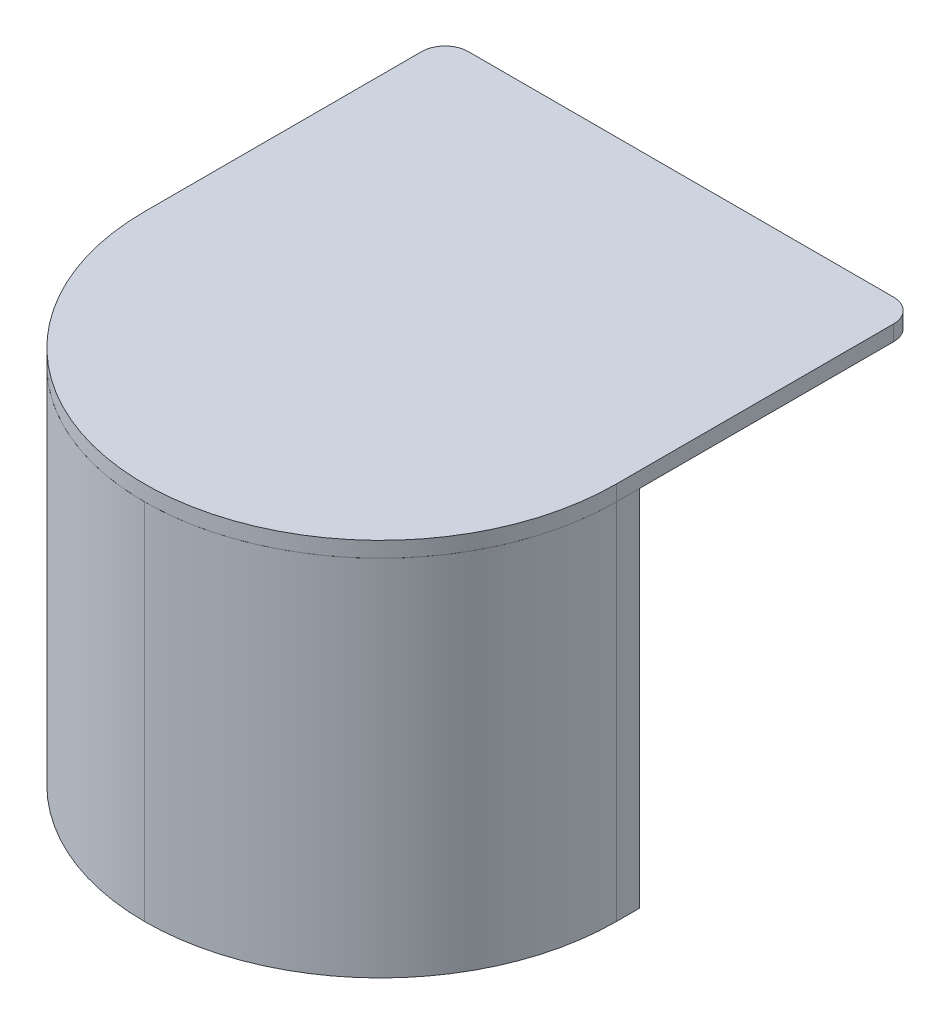
ISO-10303-21;
HEADER;
FILE_DESCRIPTION(('STEP AP214'),'2;1');
FILE_NAME('part.step','',(''),(''),'','','');
FILE_SCHEMA(('AUTOMOTIVE_DESIGN { 1 0 10303 214 1 1 1 1 }'));
ENDSEC;
DATA;
#1=APPLICATION_CONTEXT('core data for automotive mechanical design processes');
#2=APPLICATION_PROTOCOL_DEFINITION('international standard','automotive_design',2000,#1);
#3=PRODUCT_CONTEXT('',#1,'mechanical');
#4=PRODUCT('Part','Part','',(#3));
#5=PRODUCT_RELATED_PRODUCT_CATEGORY('part','',(#4));
#6=PRODUCT_DEFINITION_FORMATION('','',#4);
#7=PRODUCT_DEFINITION_CONTEXT('part definition',#1,'design');
#8=PRODUCT_DEFINITION('design','',#6,#7);
#9=PRODUCT_DEFINITION_SHAPE('','',#8);
#10=(LENGTH_UNIT() NAMED_UNIT(*) SI_UNIT(.MILLI.,.METRE.));
#11=(NAMED_UNIT(*) PLANE_ANGLE_UNIT() SI_UNIT($,.RADIAN.));
#12=(NAMED_UNIT(*) SI_UNIT($,.STERADIAN.) SOLID_ANGLE_UNIT());
#13=UNCERTAINTY_MEASURE_WITH_UNIT(LENGTH_MEASURE(1.E-05),#10,'distance_accuracy_value','');
#14=(GEOMETRIC_REPRESENTATION_CONTEXT(3) GLOBAL_UNCERTAINTY_ASSIGNED_CONTEXT((#13)) GLOBAL_UNIT_ASSIGNED_CONTEXT((#10,
#11,#12)) REPRESENTATION_CONTEXT('',''));
#15=CARTESIAN_POINT('',(0.,0.,0.));
#16=DIRECTION('',(0.,0.,1.));
#17=DIRECTION('',(1.,0.,0.));
#18=AXIS2_PLACEMENT_3D('',#15,#16,#17);
#19=CARTESIAN_POINT('',(0.,49.,-52.5965975451931));
#20=DIRECTION('',(0.,0.,-1.));
#21=DIRECTION('',(-1.,0.,0.));
#22=AXIS2_PLACEMENT_3D('',#19,#20,#21);
#23=PLANE('',#22);
#24=DIRECTION('',(1.,0.,0.));
#25=VECTOR('',#24,1.);
#26=CARTESIAN_POINT('',(0.,47.,-52.5965975451931));
#27=LINE('',#26,#25);
#28=CARTESIAN_POINT('',(-27.5,47.,-52.5965975451931));
#29=VERTEX_POINT('',#28);
#30=CARTESIAN_POINT('',(27.5,47.,-52.5965975451931));
#31=VERTEX_POINT('',#30);
#32=EDGE_CURVE('E130',#29,#31,#27,.T.);
#33=ORIENTED_EDGE('',*,*,#32,.F.);
#34=DIRECTION('',(0.,-1.,0.));
#35=VECTOR('',#34,1.);
#36=CARTESIAN_POINT('',(-27.5,49.,-52.5965975451931));
#37=LINE('',#36,#35);
#38=CARTESIAN_POINT('',(-27.5,49.,-52.5965975451931));
#39=VERTEX_POINT('',#38);
#40=EDGE_CURVE('E147',#29,#39,#37,.F.);
#41=ORIENTED_EDGE('',*,*,#40,.T.);
#42=DIRECTION('',(1.,0.,0.));
#43=VECTOR('',#42,1.);
#44=CARTESIAN_POINT('',(0.,49.,-52.5965975451931));
#45=LINE('',#44,#43);
#46=CARTESIAN_POINT('',(27.5,49.,-52.5965975451931));
#47=VERTEX_POINT('',#46);
#48=EDGE_CURVE('E111',#39,#47,#45,.T.);
#49=ORIENTED_EDGE('',*,*,#48,.T.);
#50=DIRECTION('',(0.,-1.,0.));
#51=VECTOR('',#50,1.);
#52=CARTESIAN_POINT('',(27.5,47.,-52.5965975451931));
#53=LINE('',#52,#51);
#54=EDGE_CURVE('E144',#47,#31,#53,.T.);
#55=ORIENTED_EDGE('',*,*,#54,.T.);
#56=EDGE_LOOP('',(#33,#41,#49,#55));
#57=FACE_BOUND('',#56,.T.);
#58=ADVANCED_FACE('F49',(#57),#23,.T.);
#59=CARTESIAN_POINT('',(-30.5,49.,0.));
#60=DIRECTION('',(1.,0.,0.));
#61=DIRECTION('',(0.,0.,-1.));
#62=AXIS2_PLACEMENT_3D('',#59,#60,#61);
#63=PLANE('',#62);
#64=DIRECTION('',(0.,0.,1.));
#65=VECTOR('',#64,1.);
#66=CARTESIAN_POINT('',(-30.5,49.,0.));
#67=LINE('',#66,#65);
#68=CARTESIAN_POINT('',(-30.5,49.,-49.5965975451931));
#69=VERTEX_POINT('',#68);
#70=CARTESIAN_POINT('',(-30.5,49.,-13.75));
#71=VERTEX_POINT('',#70);
#72=EDGE_CURVE('E101',#69,#71,#67,.T.);
#73=ORIENTED_EDGE('',*,*,#72,.F.);
#74=DIRECTION('',(0.,-1.,0.));
#75=VECTOR('',#74,1.);
#76=CARTESIAN_POINT('',(-30.5,47.,-49.5965975451931));
#77=LINE('',#76,#75);
#78=CARTESIAN_POINT('',(-30.5,47.,-49.5965975451931));
#79=VERTEX_POINT('',#78);
#80=EDGE_CURVE('E120',#69,#79,#77,.T.);
#81=ORIENTED_EDGE('',*,*,#80,.T.);
#82=DIRECTION('',(0.,0.,1.));
#83=VECTOR('',#82,1.);
#84=CARTESIAN_POINT('',(-30.5,47.,0.));
#85=LINE('',#84,#83);
#86=CARTESIAN_POINT('',(-30.5,47.,-13.75));
#87=VERTEX_POINT('',#86);
#88=EDGE_CURVE('E117',#79,#87,#85,.T.);
#89=ORIENTED_EDGE('',*,*,#88,.T.);
#90=DIRECTION('',(0.,-1.,0.));
#91=VECTOR('',#90,1.);
#92=CARTESIAN_POINT('',(-30.5,49.,-13.75));
#93=LINE('',#92,#91);
#94=EDGE_CURVE('E114',#71,#87,#93,.T.);
#95=ORIENTED_EDGE('',*,*,#94,.F.);
#96=EDGE_LOOP('',(#73,#81,#89,#95));
#97=FACE_BOUND('',#96,.T.);
#98=ADVANCED_FACE('F115',(#97),#63,.F.);
#99=CARTESIAN_POINT('',(0.,49.,-13.75));
#100=DIRECTION('',(0.,-1.,0.));
#101=DIRECTION('',(0.,0.,-1.));
#102=AXIS2_PLACEMENT_3D('',#99,#100,#101);
#103=CYLINDRICAL_SURFACE('',#102,30.5);
#104=CARTESIAN_POINT('',(0.,47.,-13.75));
#105=DIRECTION('',(0.,1.,0.));
#106=DIRECTION('',(0.,0.,1.));
#107=AXIS2_PLACEMENT_3D('',#104,#105,#106);
#108=CIRCLE('',#107,30.5);
#109=CARTESIAN_POINT('',(30.5,47.,-13.75));
#110=VERTEX_POINT('',#109);
#111=EDGE_CURVE('E134',#87,#110,#108,.T.);
#112=ORIENTED_EDGE('',*,*,#111,.T.);
#113=DIRECTION('',(0.,-1.,0.));
#114=VECTOR('',#113,1.);
#115=CARTESIAN_POINT('',(30.5,49.,-13.75));
#116=LINE('',#115,#114);
#117=CARTESIAN_POINT('',(30.5,49.,-13.75));
#118=VERTEX_POINT('',#117);
#119=EDGE_CURVE('E121',#118,#110,#116,.T.);
#120=ORIENTED_EDGE('',*,*,#119,.F.);
#121=CARTESIAN_POINT('',(0.,49.,-13.75));
#122=DIRECTION('',(0.,1.,0.));
#123=DIRECTION('',(0.,0.,1.));
#124=AXIS2_PLACEMENT_3D('',#121,#122,#123);
#125=CIRCLE('',#124,30.5);
#126=EDGE_CURVE('E105',#71,#118,#125,.T.);
#127=ORIENTED_EDGE('',*,*,#126,.F.);
#128=ORIENTED_EDGE('',*,*,#94,.T.);
#129=EDGE_LOOP('',(#112,#120,#127,#128));
#130=FACE_BOUND('',#129,.T.);
#131=ADVANCED_FACE('F123',(#130),#103,.T.);
#132=CARTESIAN_POINT('',(30.5,49.,0.));
#133=DIRECTION('',(-1.,0.,0.));
#134=DIRECTION('',(0.,0.,1.));
#135=AXIS2_PLACEMENT_3D('',#132,#133,#134);
#136=PLANE('',#135);
#137=DIRECTION('',(0.,0.,-1.));
#138=VECTOR('',#137,1.);
#139=CARTESIAN_POINT('',(30.5,47.,0.));
#140=LINE('',#139,#138);
#141=CARTESIAN_POINT('',(30.5,47.,-49.5965975451931));
#142=VERTEX_POINT('',#141);
#143=EDGE_CURVE('E136',#110,#142,#140,.T.);
#144=ORIENTED_EDGE('',*,*,#143,.T.);
#145=DIRECTION('',(0.,-1.,0.));
#146=VECTOR('',#145,1.);
#147=CARTESIAN_POINT('',(30.5,49.,-49.5965975451931));
#148=LINE('',#147,#146);
#149=CARTESIAN_POINT('',(30.5,49.,-49.5965975451931));
#150=VERTEX_POINT('',#149);
#151=EDGE_CURVE('E12',#142,#150,#148,.F.);
#152=ORIENTED_EDGE('',*,*,#151,.T.);
#153=DIRECTION('',(0.,0.,-1.));
#154=VECTOR('',#153,1.);
#155=CARTESIAN_POINT('',(30.5,49.,0.));
#156=LINE('',#155,#154);
#157=EDGE_CURVE('E125',#118,#150,#156,.T.);
#158=ORIENTED_EDGE('',*,*,#157,.F.);
#159=ORIENTED_EDGE('',*,*,#119,.T.);
#160=EDGE_LOOP('',(#144,#152,#158,#159));
#161=FACE_BOUND('',#160,.T.);
#162=ADVANCED_FACE('F158',(#161),#136,.F.);
#163=CARTESIAN_POINT('',(0.,49.,0.));
#164=DIRECTION('',(0.,1.,0.));
#165=DIRECTION('',(0.,0.,1.));
#166=AXIS2_PLACEMENT_3D('',#163,#164,#165);
#167=PLANE('',#166);
#168=ORIENTED_EDGE('',*,*,#48,.F.);
#169=CARTESIAN_POINT('',(-27.5,49.,-49.5965975451931));
#170=DIRECTION('',(0.,1.,0.));
#171=DIRECTION('',(0.,0.,1.));
#172=AXIS2_PLACEMENT_3D('',#169,#170,#171);
#173=CIRCLE('',#172,3.);
#174=EDGE_CURVE('E57',#39,#69,#173,.T.);
#175=ORIENTED_EDGE('',*,*,#174,.T.);
#176=ORIENTED_EDGE('',*,*,#72,.T.);
#177=ORIENTED_EDGE('',*,*,#126,.T.);
#178=ORIENTED_EDGE('',*,*,#157,.T.);
#179=CARTESIAN_POINT('',(27.5,49.,-49.5965975451931));
#180=DIRECTION('',(0.,1.,0.));
#181=DIRECTION('',(0.,0.,1.));
#182=AXIS2_PLACEMENT_3D('',#179,#180,#181);
#183=CIRCLE('',#182,3.);
#184=EDGE_CURVE('E69',#150,#47,#183,.T.);
#185=ORIENTED_EDGE('',*,*,#184,.T.);
#186=EDGE_LOOP('',(#168,#175,#176,#177,#178,#185));
#187=FACE_BOUND('',#186,.T.);
#188=ADVANCED_FACE('F103',(#187),#167,.T.);
#189=CARTESIAN_POINT('',(0.,47.,0.));
#190=DIRECTION('',(0.,1.,0.));
#191=DIRECTION('',(0.,0.,1.));
#192=AXIS2_PLACEMENT_3D('',#189,#190,#191);
#193=PLANE('',#192);
#194=ORIENTED_EDGE('',*,*,#88,.F.);
#195=CARTESIAN_POINT('',(-27.5,47.,-49.5965975451931));
#196=DIRECTION('',(0.,1.,0.));
#197=DIRECTION('',(0.,0.,1.));
#198=AXIS2_PLACEMENT_3D('',#195,#196,#197);
#199=CIRCLE('',#198,3.);
#200=EDGE_CURVE('E142',#79,#29,#199,.F.);
#201=ORIENTED_EDGE('',*,*,#200,.T.);
#202=ORIENTED_EDGE('',*,*,#32,.T.);
#203=CARTESIAN_POINT('',(27.5,47.,-49.5965975451931));
#204=DIRECTION('',(0.,1.,0.));
#205=DIRECTION('',(0.,0.,1.));
#206=AXIS2_PLACEMENT_3D('',#203,#204,#205);
#207=CIRCLE('',#206,3.);
#208=EDGE_CURVE('E140',#31,#142,#207,.F.);
#209=ORIENTED_EDGE('',*,*,#208,.T.);
#210=ORIENTED_EDGE('',*,*,#143,.F.);
#211=ORIENTED_EDGE('',*,*,#111,.F.);
#212=EDGE_LOOP('',(#194,#201,#202,#209,#210,#211));
#213=FACE_BOUND('',#212,.T.);
#214=ADVANCED_FACE('F156',(#213),#193,.F.);
#215=CARTESIAN_POINT('',(-27.5,49.,-49.5965975451931));
#216=DIRECTION('',(0.,1.,0.));
#217=DIRECTION('',(0.,0.,1.));
#218=AXIS2_PLACEMENT_3D('',#215,#216,#217);
#219=CYLINDRICAL_SURFACE('',#218,3.);
#220=ORIENTED_EDGE('',*,*,#174,.F.);
#221=ORIENTED_EDGE('',*,*,#40,.F.);
#222=ORIENTED_EDGE('',*,*,#200,.F.);
#223=ORIENTED_EDGE('',*,*,#80,.F.);
#224=EDGE_LOOP('',(#220,#221,#222,#223));
#225=FACE_BOUND('',#224,.T.);
#226=ADVANCED_FACE('F154',(#225),#219,.T.);
#227=CARTESIAN_POINT('',(27.5,49.,-49.5965975451931));
#228=DIRECTION('',(0.,1.,0.));
#229=DIRECTION('',(0.,0.,1.));
#230=AXIS2_PLACEMENT_3D('',#227,#228,#229);
#231=CYLINDRICAL_SURFACE('',#230,3.);
#232=ORIENTED_EDGE('',*,*,#184,.F.);
#233=ORIENTED_EDGE('',*,*,#151,.F.);
#234=ORIENTED_EDGE('',*,*,#208,.F.);
#235=ORIENTED_EDGE('',*,*,#54,.F.);
#236=EDGE_LOOP('',(#232,#233,#234,#235));
#237=FACE_BOUND('',#236,.T.);
#238=ADVANCED_FACE('F51',(#237),#231,.T.);
#239=CLOSED_SHELL('',(#58,#98,#131,#162,#188,#214,#226,#238));
#240=MANIFOLD_SOLID_BREP('B2',#239);
#241=CARTESIAN_POINT('',(-30.5,50.,-16.75));
#242=DIRECTION('',(0.,0.,1.));
#243=DIRECTION('',(1.,0.,0.));
#244=AXIS2_PLACEMENT_3D('',#241,#242,#243);
#245=PLANE('',#244);
#246=DIRECTION('',(0.,-1.,0.));
#247=VECTOR('',#246,1.);
#248=CARTESIAN_POINT('',(-30.5,50.,-16.75));
#249=LINE('',#248,#247);
#250=CARTESIAN_POINT('',(-30.5,47.,-16.75));
#251=VERTEX_POINT('',#250);
#252=CARTESIAN_POINT('',(-30.5,0.,-16.75));
#253=VERTEX_POINT('',#252);
#254=EDGE_CURVE('E390',#251,#253,#249,.T.);
#255=ORIENTED_EDGE('',*,*,#254,.F.);
#256=DIRECTION('',(-1.,0.,0.));
#257=VECTOR('',#256,1.);
#258=CARTESIAN_POINT('',(30.5,47.,-16.75));
#259=LINE('',#258,#257);
#260=CARTESIAN_POINT('',(-27.5,47.,-16.75));
#261=VERTEX_POINT('',#260);
#262=EDGE_CURVE('E382',#261,#251,#259,.T.);
#263=ORIENTED_EDGE('',*,*,#262,.F.);
#264=DIRECTION('',(0.,1.,0.));
#265=VECTOR('',#264,1.);
#266=CARTESIAN_POINT('',(-27.5,3.,-16.75));
#267=LINE('',#266,#265);
#268=CARTESIAN_POINT('',(-27.5,3.,-16.75));
#269=VERTEX_POINT('',#268);
#270=EDGE_CURVE('E421',#269,#261,#267,.T.);
#271=ORIENTED_EDGE('',*,*,#270,.F.);
#272=DIRECTION('',(-1.,0.,0.));
#273=VECTOR('',#272,1.);
#274=CARTESIAN_POINT('',(27.5,3.,-16.75));
#275=LINE('',#274,#273);
#276=CARTESIAN_POINT('',(-25.4803846124818,3.,-16.75));
#277=VERTEX_POINT('',#276);
#278=EDGE_CURVE('E484',#277,#269,#275,.T.);
#279=ORIENTED_EDGE('',*,*,#278,.F.);
#280=DIRECTION('',(0.,-1.,0.));
#281=VECTOR('',#280,1.);
#282=CARTESIAN_POINT('',(-25.4803846124818,50.,-16.75));
#283=LINE('',#282,#281);
#284=CARTESIAN_POINT('',(-25.4803846124818,0.,-16.75));
#285=VERTEX_POINT('',#284);
#286=EDGE_CURVE('E47',#277,#285,#283,.T.);
#287=ORIENTED_EDGE('',*,*,#286,.T.);
#288=DIRECTION('',(-1.,0.,0.));
#289=VECTOR('',#288,1.);
#290=CARTESIAN_POINT('',(-30.5,0.,-16.75));
#291=LINE('',#290,#289);
#292=EDGE_CURVE('E472',#285,#253,#291,.T.);
#293=ORIENTED_EDGE('',*,*,#292,.T.);
#294=EDGE_LOOP('',(#255,#263,#271,#279,#287,#293));
#295=FACE_BOUND('',#294,.T.);
#296=ADVANCED_FACE('F260',(#295),#245,.F.);
#297=CARTESIAN_POINT('',(30.5,50.,16.75));
#298=DIRECTION('',(-1.,0.,0.));
#299=DIRECTION('',(0.,0.,1.));
#300=AXIS2_PLACEMENT_3D('',#297,#298,#299);
#301=PLANE('',#300);
#302=DIRECTION('',(0.,-1.,0.));
#303=VECTOR('',#302,1.);
#304=CARTESIAN_POINT('',(30.5,50.,-16.75));
#305=LINE('',#304,#303);
#306=CARTESIAN_POINT('',(30.5,47.,-16.75));
#307=VERTEX_POINT('',#306);
#308=CARTESIAN_POINT('',(30.5,0.,-16.75));
#309=VERTEX_POINT('',#308);
#310=EDGE_CURVE('E376',#307,#309,#305,.T.);
#311=ORIENTED_EDGE('',*,*,#310,.F.);
#312=DIRECTION('',(0.,0.,-1.));
#313=VECTOR('',#312,1.);
#314=CARTESIAN_POINT('',(30.5,47.,383.25));
#315=LINE('',#314,#313);
#316=CARTESIAN_POINT('',(30.5,47.,-13.75));
#317=VERTEX_POINT('',#316);
#318=EDGE_CURVE('E360',#317,#307,#315,.T.);
#319=ORIENTED_EDGE('',*,*,#318,.F.);
#320=DIRECTION('',(0.,-1.,0.));
#321=VECTOR('',#320,1.);
#322=CARTESIAN_POINT('',(30.5,50.,-13.75));
#323=LINE('',#322,#321);
#324=CARTESIAN_POINT('',(30.5,0.,-13.75));
#325=VERTEX_POINT('',#324);
#326=EDGE_CURVE('E432',#317,#325,#323,.T.);
#327=ORIENTED_EDGE('',*,*,#326,.T.);
#328=DIRECTION('',(0.,0.,-1.));
#329=VECTOR('',#328,1.);
#330=CARTESIAN_POINT('',(30.5,0.,16.75));
#331=LINE('',#330,#329);
#332=EDGE_CURVE('E386',#325,#309,#331,.T.);
#333=ORIENTED_EDGE('',*,*,#332,.T.);
#334=EDGE_LOOP('',(#311,#319,#327,#333));
#335=FACE_BOUND('',#334,.T.);
#336=ADVANCED_FACE('F384',(#335),#301,.F.);
#337=DIRECTION('',(0.,-1.,0.));
#338=VECTOR('',#337,1.);
#339=CARTESIAN_POINT('',(27.5,3.,-16.75));
#340=LINE('',#339,#338);
#341=CARTESIAN_POINT('',(27.5,47.,-16.75));
#342=VERTEX_POINT('',#341);
#343=CARTESIAN_POINT('',(27.5,3.,-16.75));
#344=VERTEX_POINT('',#343);
#345=EDGE_CURVE('E380',#342,#344,#340,.T.);
#346=ORIENTED_EDGE('',*,*,#345,.F.);
#347=EDGE_CURVE('E363',#307,#342,#259,.T.);
#348=ORIENTED_EDGE('',*,*,#347,.F.);
#349=ORIENTED_EDGE('',*,*,#310,.T.);
#350=CARTESIAN_POINT('',(25.4803846124818,0.,-16.75));
#351=VERTEX_POINT('',#350);
#352=EDGE_CURVE('E465',#309,#351,#291,.T.);
#353=ORIENTED_EDGE('',*,*,#352,.T.);
#354=DIRECTION('',(0.,-1.,0.));
#355=VECTOR('',#354,1.);
#356=CARTESIAN_POINT('',(25.4803846124818,50.,-16.75));
#357=LINE('',#356,#355);
#358=CARTESIAN_POINT('',(25.4803846124818,3.,-16.75));
#359=VERTEX_POINT('',#358);
#360=EDGE_CURVE('E443',#351,#359,#357,.F.);
#361=ORIENTED_EDGE('',*,*,#360,.T.);
#362=EDGE_CURVE('E479',#344,#359,#275,.T.);
#363=ORIENTED_EDGE('',*,*,#362,.F.);
#364=EDGE_LOOP('',(#346,#348,#349,#353,#361,#363));
#365=FACE_BOUND('',#364,.T.);
#366=ADVANCED_FACE('F374',(#365),#245,.F.);
#367=CARTESIAN_POINT('',(-30.5,50.,16.75));
#368=DIRECTION('',(1.,0.,0.));
#369=DIRECTION('',(0.,0.,-1.));
#370=AXIS2_PLACEMENT_3D('',#367,#368,#369);
#371=PLANE('',#370);
#372=DIRECTION('',(0.,-1.,0.));
#373=VECTOR('',#372,1.);
#374=CARTESIAN_POINT('',(-30.5,50.,-13.75));
#375=LINE('',#374,#373);
#376=CARTESIAN_POINT('',(-30.5,0.,-13.75));
#377=VERTEX_POINT('',#376);
#378=CARTESIAN_POINT('',(-30.5,47.,-13.75));
#379=VERTEX_POINT('',#378);
#380=EDGE_CURVE('E428',#377,#379,#375,.F.);
#381=ORIENTED_EDGE('',*,*,#380,.T.);
#382=DIRECTION('',(0.,0.,-1.));
#383=VECTOR('',#382,1.);
#384=CARTESIAN_POINT('',(-30.5,47.,383.25));
#385=LINE('',#384,#383);
#386=EDGE_CURVE('E276',#379,#251,#385,.T.);
#387=ORIENTED_EDGE('',*,*,#386,.T.);
#388=ORIENTED_EDGE('',*,*,#254,.T.);
#389=DIRECTION('',(0.,0.,1.));
#390=VECTOR('',#389,1.);
#391=CARTESIAN_POINT('',(-30.5,0.,16.75));
#392=LINE('',#391,#390);
#393=EDGE_CURVE('E396',#253,#377,#392,.T.);
#394=ORIENTED_EDGE('',*,*,#393,.T.);
#395=EDGE_LOOP('',(#381,#387,#388,#394));
#396=FACE_BOUND('',#395,.T.);
#397=ADVANCED_FACE('F518',(#396),#371,.F.);
#398=CARTESIAN_POINT('',(0.,0.,0.));
#399=DIRECTION('',(0.,-1.,0.));
#400=DIRECTION('',(0.,0.,-1.));
#401=AXIS2_PLACEMENT_3D('',#398,#399,#400);
#402=PLANE('',#401);
#403=CARTESIAN_POINT('',(0.,0.,-13.7500000000001));
#404=DIRECTION('',(0.,-1.,0.));
#405=DIRECTION('',(0.,0.,-1.));
#406=AXIS2_PLACEMENT_3D('',#403,#404,#405);
#407=CIRCLE('',#406,23.5);
#408=CARTESIAN_POINT('',(23.4819230742479,0.,-14.671568627451));
#409=VERTEX_POINT('',#408);
#410=CARTESIAN_POINT('',(-23.481923074248,0.,-14.671568627451));
#411=VERTEX_POINT('',#410);
#412=EDGE_CURVE('E439',#409,#411,#407,.T.);
#413=ORIENTED_EDGE('',*,*,#412,.F.);
#414=CARTESIAN_POINT('',(25.4803846124818,0.,-14.75));
#415=DIRECTION('',(0.,-1.,0.));
#416=DIRECTION('',(0.,0.,-1.));
#417=AXIS2_PLACEMENT_3D('',#414,#415,#416);
#418=CIRCLE('',#417,2.);
#419=EDGE_CURVE('E269',#409,#351,#418,.T.);
#420=ORIENTED_EDGE('',*,*,#419,.T.);
#421=ORIENTED_EDGE('',*,*,#352,.F.);
#422=ORIENTED_EDGE('',*,*,#332,.F.);
#423=CARTESIAN_POINT('',(0.,0.,-13.75));
#424=DIRECTION('',(0.,-1.,0.));
#425=DIRECTION('',(0.,0.,-1.));
#426=AXIS2_PLACEMENT_3D('',#423,#424,#425);
#427=CIRCLE('',#426,30.5);
#428=CARTESIAN_POINT('',(0.,0.,16.75));
#429=VERTEX_POINT('',#428);
#430=EDGE_CURVE('E416',#325,#429,#427,.T.);
#431=ORIENTED_EDGE('',*,*,#430,.T.);
#432=CARTESIAN_POINT('',(0.,0.,-13.75));
#433=DIRECTION('',(0.,-1.,0.));
#434=DIRECTION('',(0.,0.,-1.));
#435=AXIS2_PLACEMENT_3D('',#432,#433,#434);
#436=CIRCLE('',#435,30.5);
#437=EDGE_CURVE('E425',#429,#377,#436,.T.);
#438=ORIENTED_EDGE('',*,*,#437,.T.);
#439=ORIENTED_EDGE('',*,*,#393,.F.);
#440=ORIENTED_EDGE('',*,*,#292,.F.);
#441=CARTESIAN_POINT('',(-25.4803846124818,0.,-14.75));
#442=DIRECTION('',(0.,-1.,0.));
#443=DIRECTION('',(0.,0.,-1.));
#444=AXIS2_PLACEMENT_3D('',#441,#442,#443);
#445=CIRCLE('',#444,2.);
#446=EDGE_CURVE('E284',#285,#411,#445,.T.);
#447=ORIENTED_EDGE('',*,*,#446,.T.);
#448=EDGE_LOOP('',(#413,#420,#421,#422,#431,#438,#439,#440,#447));
#449=FACE_BOUND('',#448,.T.);
#450=ADVANCED_FACE('F464',(#449),#402,.T.);
#451=CARTESIAN_POINT('',(-27.5,3.,13.75));
#452=DIRECTION('',(-1.,0.,0.));
#453=DIRECTION('',(0.,0.,1.));
#454=AXIS2_PLACEMENT_3D('',#451,#452,#453);
#455=PLANE('',#454);
#456=DIRECTION('',(0.,0.,-1.));
#457=VECTOR('',#456,1.);
#458=CARTESIAN_POINT('',(-27.5,47.,13.75));
#459=LINE('',#458,#457);
#460=CARTESIAN_POINT('',(-27.5,47.,-13.75));
#461=VERTEX_POINT('',#460);
#462=EDGE_CURVE('E497',#461,#261,#459,.T.);
#463=ORIENTED_EDGE('',*,*,#462,.F.);
#464=DIRECTION('',(0.,1.,0.));
#465=VECTOR('',#464,1.);
#466=CARTESIAN_POINT('',(-27.5,3.,-13.75));
#467=LINE('',#466,#465);
#468=CARTESIAN_POINT('',(-27.5,3.,-13.75));
#469=VERTEX_POINT('',#468);
#470=EDGE_CURVE('E402',#461,#469,#467,.F.);
#471=ORIENTED_EDGE('',*,*,#470,.T.);
#472=DIRECTION('',(0.,0.,-1.));
#473=VECTOR('',#472,1.);
#474=CARTESIAN_POINT('',(-27.5,3.,13.75));
#475=LINE('',#474,#473);
#476=EDGE_CURVE('E501',#469,#269,#475,.T.);
#477=ORIENTED_EDGE('',*,*,#476,.T.);
#478=ORIENTED_EDGE('',*,*,#270,.T.);
#479=EDGE_LOOP('',(#463,#471,#477,#478));
#480=FACE_BOUND('',#479,.T.);
#481=ADVANCED_FACE('F535',(#480),#455,.F.);
#482=CARTESIAN_POINT('',(27.5,3.,13.75));
#483=DIRECTION('',(0.,-1.,0.));
#484=DIRECTION('',(0.,0.,-1.));
#485=AXIS2_PLACEMENT_3D('',#482,#483,#484);
#486=PLANE('',#485);
#487=ORIENTED_EDGE('',*,*,#362,.T.);
#488=CARTESIAN_POINT('',(25.4803846124818,3.,-14.75));
#489=DIRECTION('',(0.,-1.,0.));
#490=DIRECTION('',(0.,0.,-1.));
#491=AXIS2_PLACEMENT_3D('',#488,#489,#490);
#492=CIRCLE('',#491,2.);
#493=CARTESIAN_POINT('',(23.4819230742479,3.,-14.671568627451));
#494=VERTEX_POINT('',#493);
#495=EDGE_CURVE('E450',#359,#494,#492,.F.);
#496=ORIENTED_EDGE('',*,*,#495,.T.);
#497=CARTESIAN_POINT('',(0.,3.,-13.7500000000001));
#498=DIRECTION('',(0.,-1.,0.));
#499=DIRECTION('',(0.,0.,-1.));
#500=AXIS2_PLACEMENT_3D('',#497,#498,#499);
#501=CIRCLE('',#500,23.5);
#502=CARTESIAN_POINT('',(-23.481923074248,3.,-14.671568627451));
#503=VERTEX_POINT('',#502);
#504=EDGE_CURVE('E435',#494,#503,#501,.T.);
#505=ORIENTED_EDGE('',*,*,#504,.T.);
#506=CARTESIAN_POINT('',(-25.4803846124818,3.,-14.75));
#507=DIRECTION('',(0.,-1.,0.));
#508=DIRECTION('',(0.,0.,-1.));
#509=AXIS2_PLACEMENT_3D('',#506,#507,#508);
#510=CIRCLE('',#509,2.);
#511=EDGE_CURVE('E447',#503,#277,#510,.F.);
#512=ORIENTED_EDGE('',*,*,#511,.T.);
#513=ORIENTED_EDGE('',*,*,#278,.T.);
#514=ORIENTED_EDGE('',*,*,#476,.F.);
#515=CARTESIAN_POINT('',(0.,3.,-13.75));
#516=DIRECTION('',(0.,-1.,0.));
#517=DIRECTION('',(0.,0.,-1.));
#518=AXIS2_PLACEMENT_3D('',#515,#516,#517);
#519=CIRCLE('',#518,27.5);
#520=CARTESIAN_POINT('',(0.,3.,13.75));
#521=VERTEX_POINT('',#520);
#522=EDGE_CURVE('E409',#469,#521,#519,.F.);
#523=ORIENTED_EDGE('',*,*,#522,.T.);
#524=CARTESIAN_POINT('',(0.,3.,-13.75));
#525=DIRECTION('',(0.,-1.,0.));
#526=DIRECTION('',(0.,0.,-1.));
#527=AXIS2_PLACEMENT_3D('',#524,#525,#526);
#528=CIRCLE('',#527,27.5);
#529=CARTESIAN_POINT('',(27.5,3.,-13.75));
#530=VERTEX_POINT('',#529);
#531=EDGE_CURVE('E406',#521,#530,#528,.F.);
#532=ORIENTED_EDGE('',*,*,#531,.T.);
#533=DIRECTION('',(0.,0.,-1.));
#534=VECTOR('',#533,1.);
#535=CARTESIAN_POINT('',(27.5,3.,13.75));
#536=LINE('',#535,#534);
#537=EDGE_CURVE('E504',#530,#344,#536,.T.);
#538=ORIENTED_EDGE('',*,*,#537,.T.);
#539=EDGE_LOOP('',(#487,#496,#505,#512,#513,#514,#523,#532,#538));
#540=FACE_BOUND('',#539,.T.);
#541=ADVANCED_FACE('F477',(#540),#486,.F.);
#542=CARTESIAN_POINT('',(27.5,3.,13.75));
#543=DIRECTION('',(1.,0.,0.));
#544=DIRECTION('',(0.,0.,-1.));
#545=AXIS2_PLACEMENT_3D('',#542,#543,#544);
#546=PLANE('',#545);
#547=ORIENTED_EDGE('',*,*,#537,.F.);
#548=DIRECTION('',(0.,-1.,0.));
#549=VECTOR('',#548,1.);
#550=CARTESIAN_POINT('',(27.5,47.,-13.75));
#551=LINE('',#550,#549);
#552=CARTESIAN_POINT('',(27.5,47.,-13.75));
#553=VERTEX_POINT('',#552);
#554=EDGE_CURVE('E412',#530,#553,#551,.F.);
#555=ORIENTED_EDGE('',*,*,#554,.T.);
#556=DIRECTION('',(0.,0.,-1.));
#557=VECTOR('',#556,1.);
#558=CARTESIAN_POINT('',(27.5,47.,13.75));
#559=LINE('',#558,#557);
#560=EDGE_CURVE('E507',#553,#342,#559,.T.);
#561=ORIENTED_EDGE('',*,*,#560,.T.);
#562=ORIENTED_EDGE('',*,*,#345,.T.);
#563=EDGE_LOOP('',(#547,#555,#561,#562));
#564=FACE_BOUND('',#563,.T.);
#565=ADVANCED_FACE('F548',(#564),#546,.F.);
#566=CARTESIAN_POINT('',(0.,0.,-13.75));
#567=DIRECTION('',(0.,1.,0.));
#568=DIRECTION('',(0.,0.,1.));
#569=AXIS2_PLACEMENT_3D('',#566,#567,#568);
#570=CYLINDRICAL_SURFACE('',#569,27.5);
#571=ORIENTED_EDGE('',*,*,#554,.F.);
#572=ORIENTED_EDGE('',*,*,#531,.F.);
#573=DIRECTION('',(0.,-1.,0.));
#574=VECTOR('',#573,1.);
#575=CARTESIAN_POINT('',(0.,3.,13.75));
#576=LINE('',#575,#574);
#577=CARTESIAN_POINT('',(0.,47.,13.75));
#578=VERTEX_POINT('',#577);
#579=EDGE_CURVE('E417',#578,#521,#576,.T.);
#580=ORIENTED_EDGE('',*,*,#579,.F.);
#581=CARTESIAN_POINT('',(0.,47.,-13.75));
#582=DIRECTION('',(0.,1.,0.));
#583=DIRECTION('',(0.,0.,1.));
#584=AXIS2_PLACEMENT_3D('',#581,#582,#583);
#585=CIRCLE('',#584,27.5);
#586=EDGE_CURVE('E389',#553,#578,#585,.F.);
#587=ORIENTED_EDGE('',*,*,#586,.F.);
#588=EDGE_LOOP('',(#571,#572,#580,#587));
#589=FACE_BOUND('',#588,.T.);
#590=ADVANCED_FACE('F543',(#589),#570,.F.);
#591=CARTESIAN_POINT('',(0.,0.,-13.75));
#592=DIRECTION('',(0.,-1.,0.));
#593=DIRECTION('',(0.,0.,-1.));
#594=AXIS2_PLACEMENT_3D('',#591,#592,#593);
#595=CYLINDRICAL_SURFACE('',#594,27.5);
#596=ORIENTED_EDGE('',*,*,#522,.F.);
#597=ORIENTED_EDGE('',*,*,#470,.F.);
#598=CARTESIAN_POINT('',(0.,47.,-13.75));
#599=DIRECTION('',(0.,1.,0.));
#600=DIRECTION('',(0.,0.,1.));
#601=AXIS2_PLACEMENT_3D('',#598,#599,#600);
#602=CIRCLE('',#601,27.5);
#603=EDGE_CURVE('E394',#578,#461,#602,.F.);
#604=ORIENTED_EDGE('',*,*,#603,.F.);
#605=ORIENTED_EDGE('',*,*,#579,.T.);
#606=EDGE_LOOP('',(#596,#597,#604,#605));
#607=FACE_BOUND('',#606,.T.);
#608=ADVANCED_FACE('F546',(#607),#595,.F.);
#609=CARTESIAN_POINT('',(0.,50.,-13.75));
#610=DIRECTION('',(0.,-1.,0.));
#611=DIRECTION('',(0.,0.,-1.));
#612=AXIS2_PLACEMENT_3D('',#609,#610,#611);
#613=CYLINDRICAL_SURFACE('',#612,30.5);
#614=CARTESIAN_POINT('',(0.,47.,-13.75));
#615=DIRECTION('',(0.,-1.,0.));
#616=DIRECTION('',(0.,0.,-1.));
#617=AXIS2_PLACEMENT_3D('',#614,#615,#616);
#618=CIRCLE('',#617,30.5);
#619=CARTESIAN_POINT('',(0.,47.,16.75));
#620=VERTEX_POINT('',#619);
#621=EDGE_CURVE('E366',#620,#317,#618,.F.);
#622=ORIENTED_EDGE('',*,*,#621,.F.);
#623=DIRECTION('',(0.,-1.,0.));
#624=VECTOR('',#623,1.);
#625=CARTESIAN_POINT('',(0.,50.,16.75));
#626=LINE('',#625,#624);
#627=EDGE_CURVE('E422',#429,#620,#626,.F.);
#628=ORIENTED_EDGE('',*,*,#627,.F.);
#629=ORIENTED_EDGE('',*,*,#430,.F.);
#630=ORIENTED_EDGE('',*,*,#326,.F.);
#631=EDGE_LOOP('',(#622,#628,#629,#630));
#632=FACE_BOUND('',#631,.T.);
#633=ADVANCED_FACE('F604',(#632),#613,.T.);
#634=CARTESIAN_POINT('',(0.,50.,-13.75));
#635=DIRECTION('',(0.,-1.,0.));
#636=DIRECTION('',(0.,0.,-1.));
#637=AXIS2_PLACEMENT_3D('',#634,#635,#636);
#638=CYLINDRICAL_SURFACE('',#637,30.5);
#639=CARTESIAN_POINT('',(0.,47.,-13.75));
#640=DIRECTION('',(0.,-1.,0.));
#641=DIRECTION('',(0.,0.,-1.));
#642=AXIS2_PLACEMENT_3D('',#639,#640,#641);
#643=CIRCLE('',#642,30.5);
#644=EDGE_CURVE('E522',#379,#620,#643,.F.);
#645=ORIENTED_EDGE('',*,*,#644,.F.);
#646=ORIENTED_EDGE('',*,*,#380,.F.);
#647=ORIENTED_EDGE('',*,*,#437,.F.);
#648=ORIENTED_EDGE('',*,*,#627,.T.);
#649=EDGE_LOOP('',(#645,#646,#647,#648));
#650=FACE_BOUND('',#649,.T.);
#651=ADVANCED_FACE('F521',(#650),#638,.T.);
#652=CARTESIAN_POINT('',(0.,30.5,-13.7500000000001));
#653=DIRECTION('',(0.,-1.,0.));
#654=DIRECTION('',(0.,0.,-1.));
#655=AXIS2_PLACEMENT_3D('',#652,#653,#654);
#656=CYLINDRICAL_SURFACE('',#655,23.5);
#657=ORIENTED_EDGE('',*,*,#504,.F.);
#658=DIRECTION('',(0.,-1.,0.));
#659=VECTOR('',#658,1.);
#660=CARTESIAN_POINT('',(23.4819230742479,30.5,-14.671568627451));
#661=LINE('',#660,#659);
#662=EDGE_CURVE('E456',#494,#409,#661,.T.);
#663=ORIENTED_EDGE('',*,*,#662,.T.);
#664=ORIENTED_EDGE('',*,*,#412,.T.);
#665=DIRECTION('',(0.,-1.,0.));
#666=VECTOR('',#665,1.);
#667=CARTESIAN_POINT('',(-23.481923074248,30.5,-14.671568627451));
#668=LINE('',#667,#666);
#669=EDGE_CURVE('E453',#411,#503,#668,.F.);
#670=ORIENTED_EDGE('',*,*,#669,.T.);
#671=EDGE_LOOP('',(#657,#663,#664,#670));
#672=FACE_BOUND('',#671,.T.);
#673=ADVANCED_FACE('F481',(#672),#656,.F.);
#674=CARTESIAN_POINT('',(25.4803846124818,30.5,-14.75));
#675=DIRECTION('',(0.,-1.,0.));
#676=DIRECTION('',(0.,0.,-1.));
#677=AXIS2_PLACEMENT_3D('',#674,#675,#676);
#678=CYLINDRICAL_SURFACE('',#677,2.);
#679=ORIENTED_EDGE('',*,*,#419,.F.);
#680=ORIENTED_EDGE('',*,*,#662,.F.);
#681=ORIENTED_EDGE('',*,*,#495,.F.);
#682=ORIENTED_EDGE('',*,*,#360,.F.);
#683=EDGE_LOOP('',(#679,#680,#681,#682));
#684=FACE_BOUND('',#683,.T.);
#685=ADVANCED_FACE('F474',(#684),#678,.T.);
#686=CARTESIAN_POINT('',(-25.4803846124818,30.5,-14.75));
#687=DIRECTION('',(0.,-1.,0.));
#688=DIRECTION('',(0.,0.,-1.));
#689=AXIS2_PLACEMENT_3D('',#686,#687,#688);
#690=CYLINDRICAL_SURFACE('',#689,2.);
#691=ORIENTED_EDGE('',*,*,#511,.F.);
#692=ORIENTED_EDGE('',*,*,#669,.F.);
#693=ORIENTED_EDGE('',*,*,#446,.F.);
#694=ORIENTED_EDGE('',*,*,#286,.F.);
#695=EDGE_LOOP('',(#691,#692,#693,#694));
#696=FACE_BOUND('',#695,.T.);
#697=ADVANCED_FACE('F262',(#696),#690,.T.);
#698=CARTESIAN_POINT('',(30.5,47.,383.25));
#699=DIRECTION('',(0.,-1.,0.));
#700=DIRECTION('',(0.,0.,-1.));
#701=AXIS2_PLACEMENT_3D('',#698,#699,#700);
#702=PLANE('',#701);
#703=ORIENTED_EDGE('',*,*,#262,.T.);
#704=ORIENTED_EDGE('',*,*,#386,.F.);
#705=ORIENTED_EDGE('',*,*,#644,.T.);
#706=ORIENTED_EDGE('',*,*,#621,.T.);
#707=ORIENTED_EDGE('',*,*,#318,.T.);
#708=ORIENTED_EDGE('',*,*,#347,.T.);
#709=ORIENTED_EDGE('',*,*,#560,.F.);
#710=ORIENTED_EDGE('',*,*,#586,.T.);
#711=ORIENTED_EDGE('',*,*,#603,.T.);
#712=ORIENTED_EDGE('',*,*,#462,.T.);
#713=EDGE_LOOP('',(#703,#704,#705,#706,#707,#708,#709,#710,#711,#712));
#714=FACE_BOUND('',#713,.T.);
#715=ADVANCED_FACE('F362',(#714),#702,.F.);
#716=CLOSED_SHELL('',(#296,#336,#366,#397,#450,#481,#541,#565,#590,#608,#633,#651,#673,#685,
#697,#715));
#717=MANIFOLD_SOLID_BREP('B6',#716);
#718=ADVANCED_BREP_SHAPE_REPRESENTATION('',(#18,#240,#717),#14);
#719=SHAPE_DEFINITION_REPRESENTATION(#9,#718);
ENDSEC;
END-ISO-10303-21;
